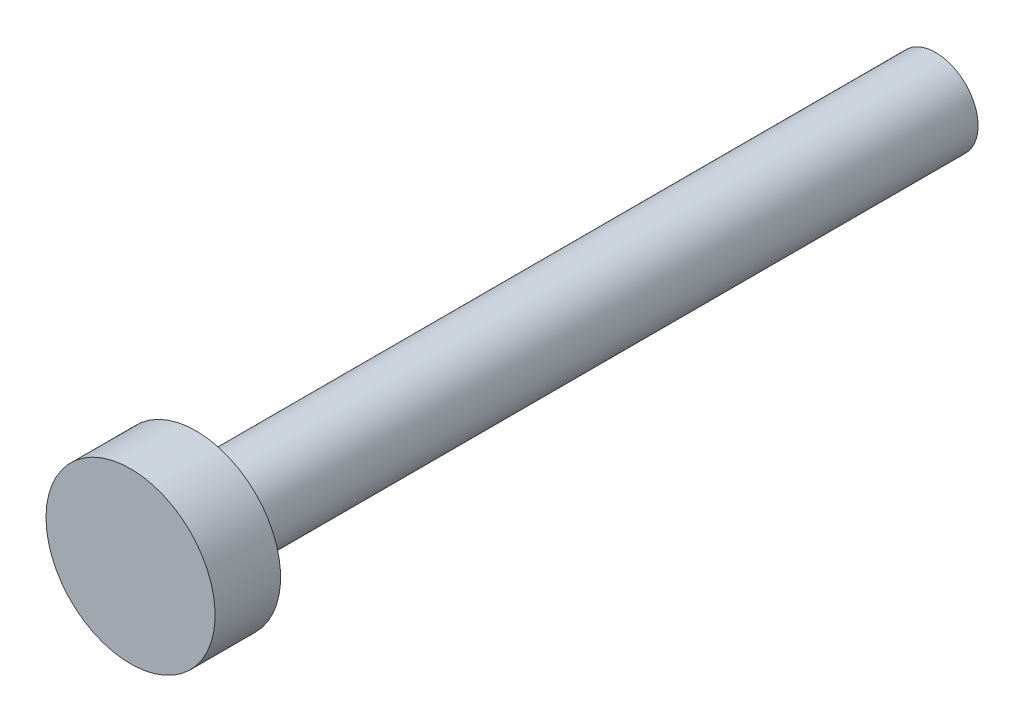
ISO-10303-21;
HEADER;
FILE_DESCRIPTION(('STEP AP214'),'2;1');
FILE_NAME('part.step','',(''),(''),'','','');
FILE_SCHEMA(('AUTOMOTIVE_DESIGN { 1 0 10303 214 1 1 1 1 }'));
ENDSEC;
DATA;
#1=APPLICATION_CONTEXT('core data for automotive mechanical design processes');
#2=APPLICATION_PROTOCOL_DEFINITION('international standard','automotive_design',2000,#1);
#3=PRODUCT_CONTEXT('',#1,'mechanical');
#4=PRODUCT('Part','Part','',(#3));
#5=PRODUCT_RELATED_PRODUCT_CATEGORY('part','',(#4));
#6=PRODUCT_DEFINITION_FORMATION('','',#4);
#7=PRODUCT_DEFINITION_CONTEXT('part definition',#1,'design');
#8=PRODUCT_DEFINITION('design','',#6,#7);
#9=PRODUCT_DEFINITION_SHAPE('','',#8);
#10=(LENGTH_UNIT() NAMED_UNIT(*) SI_UNIT(.MILLI.,.METRE.));
#11=(NAMED_UNIT(*) PLANE_ANGLE_UNIT() SI_UNIT($,.RADIAN.));
#12=(NAMED_UNIT(*) SI_UNIT($,.STERADIAN.) SOLID_ANGLE_UNIT());
#13=UNCERTAINTY_MEASURE_WITH_UNIT(LENGTH_MEASURE(1.E-05),#10,'distance_accuracy_value','');
#14=(GEOMETRIC_REPRESENTATION_CONTEXT(3) GLOBAL_UNCERTAINTY_ASSIGNED_CONTEXT((#13)) GLOBAL_UNIT_ASSIGNED_CONTEXT((#10,
#11,#12)) REPRESENTATION_CONTEXT('',''));
#15=CARTESIAN_POINT('',(0.,0.,0.));
#16=DIRECTION('',(0.,0.,1.));
#17=DIRECTION('',(1.,0.,0.));
#18=AXIS2_PLACEMENT_3D('',#15,#16,#17);
#19=CARTESIAN_POINT('',(0.,0.,3.1));
#20=DIRECTION('',(0.,0.,-1.));
#21=DIRECTION('',(-1.,0.,0.));
#22=AXIS2_PLACEMENT_3D('',#19,#20,#21);
#23=CYLINDRICAL_SURFACE('',#22,4.);
#24=CARTESIAN_POINT('',(0.,0.,3.1));
#25=DIRECTION('',(0.,0.,1.));
#26=DIRECTION('',(1.,0.,0.));
#27=AXIS2_PLACEMENT_3D('',#24,#25,#26);
#28=CIRCLE('',#27,4.);
#29=CARTESIAN_POINT('',(-4.,0.,3.1));
#30=VERTEX_POINT('',#29);
#31=EDGE_CURVE('E40',#30,#30,#28,.T.);
#32=CARTESIAN_POINT('',(0.,0.,0.));
#33=DIRECTION('',(0.,0.,1.));
#34=DIRECTION('',(1.,0.,0.));
#35=AXIS2_PLACEMENT_3D('',#32,#33,#34);
#36=CIRCLE('',#35,4.);
#37=CARTESIAN_POINT('',(-4.,0.,0.));
#38=VERTEX_POINT('',#37);
#39=EDGE_CURVE('E36',#38,#38,#36,.T.);
#40=CARTESIAN_POINT('',(-4.,0.,3.1));
#41=CARTESIAN_POINT('',(-4.,0.,3.06770833333333));
#42=CARTESIAN_POINT('',(-4.,0.,3.03541666666667));
#43=CARTESIAN_POINT('',(-4.,0.,2.97083333333333));
#44=CARTESIAN_POINT('',(-4.,0.,2.93854166666667));
#45=CARTESIAN_POINT('',(-4.,0.,2.87395833333333));
#46=CARTESIAN_POINT('',(-4.,0.,2.84166666666667));
#47=CARTESIAN_POINT('',(-4.,0.,2.77708333333333));
#48=CARTESIAN_POINT('',(-4.,0.,2.74479166666667));
#49=CARTESIAN_POINT('',(-4.,0.,2.68020833333333));
#50=CARTESIAN_POINT('',(-4.,0.,2.64791666666667));
#51=CARTESIAN_POINT('',(-4.,0.,2.58333333333333));
#52=CARTESIAN_POINT('',(-4.,0.,2.55104166666667));
#53=CARTESIAN_POINT('',(-4.,0.,2.48645833333333));
#54=CARTESIAN_POINT('',(-4.,0.,2.45416666666667));
#55=CARTESIAN_POINT('',(-4.,0.,2.38958333333333));
#56=CARTESIAN_POINT('',(-4.,0.,2.35729166666667));
#57=CARTESIAN_POINT('',(-4.,0.,2.29270833333333));
#58=CARTESIAN_POINT('',(-4.,0.,2.26041666666667));
#59=CARTESIAN_POINT('',(-4.,0.,2.19583333333333));
#60=CARTESIAN_POINT('',(-4.,0.,2.16354166666667));
#61=CARTESIAN_POINT('',(-4.,0.,2.09895833333333));
#62=CARTESIAN_POINT('',(-4.,0.,2.06666666666667));
#63=CARTESIAN_POINT('',(-4.,0.,2.00208333333333));
#64=CARTESIAN_POINT('',(-4.,0.,1.96979166666667));
#65=CARTESIAN_POINT('',(-4.,0.,1.90520833333333));
#66=CARTESIAN_POINT('',(-4.,0.,1.87291666666667));
#67=CARTESIAN_POINT('',(-4.,0.,1.80833333333333));
#68=CARTESIAN_POINT('',(-4.,0.,1.77604166666667));
#69=CARTESIAN_POINT('',(-4.,0.,1.71145833333333));
#70=CARTESIAN_POINT('',(-4.,0.,1.67916666666667));
#71=CARTESIAN_POINT('',(-4.,0.,1.61458333333333));
#72=CARTESIAN_POINT('',(-4.,0.,1.58229166666667));
#73=CARTESIAN_POINT('',(-4.,0.,1.51770833333333));
#74=CARTESIAN_POINT('',(-4.,0.,1.48541666666667));
#75=CARTESIAN_POINT('',(-4.,0.,1.42083333333333));
#76=CARTESIAN_POINT('',(-4.,0.,1.38854166666667));
#77=CARTESIAN_POINT('',(-4.,0.,1.32395833333333));
#78=CARTESIAN_POINT('',(-4.,0.,1.29166666666667));
#79=CARTESIAN_POINT('',(-4.,0.,1.22708333333333));
#80=CARTESIAN_POINT('',(-4.,0.,1.19479166666667));
#81=CARTESIAN_POINT('',(-4.,0.,1.13020833333333));
#82=CARTESIAN_POINT('',(-4.,0.,1.09791666666667));
#83=CARTESIAN_POINT('',(-4.,0.,1.03333333333333));
#84=CARTESIAN_POINT('',(-4.,0.,1.00104166666667));
#85=CARTESIAN_POINT('',(-4.,0.,0.936458333333333));
#86=CARTESIAN_POINT('',(-4.,0.,0.904166666666667));
#87=CARTESIAN_POINT('',(-4.,0.,0.839583333333333));
#88=CARTESIAN_POINT('',(-4.,0.,0.807291666666667));
#89=CARTESIAN_POINT('',(-4.,0.,0.742708333333333));
#90=CARTESIAN_POINT('',(-4.,0.,0.710416666666667));
#91=CARTESIAN_POINT('',(-4.,0.,0.645833333333333));
#92=CARTESIAN_POINT('',(-4.,0.,0.613541666666667));
#93=CARTESIAN_POINT('',(-4.,0.,0.548958333333333));
#94=CARTESIAN_POINT('',(-4.,0.,0.516666666666667));
#95=CARTESIAN_POINT('',(-4.,0.,0.452083333333333));
#96=CARTESIAN_POINT('',(-4.,0.,0.419791666666667));
#97=CARTESIAN_POINT('',(-4.,0.,0.355208333333333));
#98=CARTESIAN_POINT('',(-4.,0.,0.322916666666667));
#99=CARTESIAN_POINT('',(-4.,0.,0.258333333333333));
#100=CARTESIAN_POINT('',(-4.,0.,0.226041666666667));
#101=CARTESIAN_POINT('',(-4.,0.,0.161458333333333));
#102=CARTESIAN_POINT('',(-4.,0.,0.129166666666667));
#103=CARTESIAN_POINT('',(-4.,0.,0.0645833333333335));
#104=CARTESIAN_POINT('',(-4.,0.,0.0322916666666667));
#105=CARTESIAN_POINT('',(-4.,0.,0.));
#106=B_SPLINE_CURVE_WITH_KNOTS('',3,(#40,#41,#42,#43,#44,#45,#46,#47,#48,#49,#50,#51,#52,#53,
#54,#55,#56,#57,#58,#59,#60,#61,#62,#63,#64,#65,#66,#67,#68,#69,#70,#71,#72,#73,#74,#75,#76,#77,
#78,#79,#80,#81,#82,#83,#84,#85,#86,#87,#88,#89,#90,#91,#92,#93,#94,#95,#96,#97,#98,#99,#100,
#101,#102,#103,#104,#105),.UNSPECIFIED.,.F.,.F.,(4,2,2,2,2,2,2,2,2,2,2,2,2,2,2,2,2,2,2,2,2,2,2,
2,2,2,2,2,2,2,2,2,4),(0.,0.0968749999999997,0.19375,0.290625,0.3875,0.484375,0.58125,0.678125,
0.775,0.871874999999999,0.96875,1.065625,1.1625,1.259375,1.35625,1.453125,1.55,1.646875,1.74375,
1.840625,1.9375,2.034375,2.13125,2.228125,2.325,2.421875,2.51875,2.615625,2.7125,2.809375,
2.90625,3.003125,3.1),.UNSPECIFIED.);
#107=EDGE_CURVE('BSEAM33',#30,#38,#106,.T.);
#108=ORIENTED_EDGE('',*,*,#31,.F.);
#109=ORIENTED_EDGE('',*,*,#39,.T.);
#110=ORIENTED_EDGE('',*,*,#107,.T.);
#111=ORIENTED_EDGE('',*,*,#107,.F.);
#112=EDGE_LOOP('',(#108,#110,#109,#111));
#113=FACE_BOUND('',#112,.T.);
#114=ADVANCED_FACE('F33',(#113),#23,.T.);
#115=CARTESIAN_POINT('',(0.,0.,3.1));
#116=DIRECTION('',(0.,0.,1.));
#117=DIRECTION('',(1.,0.,0.));
#118=AXIS2_PLACEMENT_3D('',#115,#116,#117);
#119=PLANE('',#118);
#120=ORIENTED_EDGE('',*,*,#31,.T.);
#121=EDGE_LOOP('',(#120));
#122=FACE_BOUND('',#121,.T.);
#123=ADVANCED_FACE('F57',(#122),#119,.T.);
#124=CARTESIAN_POINT('',(0.,0.,0.));
#125=DIRECTION('',(0.,0.,1.));
#126=DIRECTION('',(1.,0.,0.));
#127=AXIS2_PLACEMENT_3D('',#124,#125,#126);
#128=PLANE('',#127);
#129=CARTESIAN_POINT('',(0.,0.,0.));
#130=DIRECTION('',(0.,0.,-1.));
#131=DIRECTION('',(-1.,0.,0.));
#132=AXIS2_PLACEMENT_3D('',#129,#130,#131);
#133=CIRCLE('',#132,2.);
#134=CARTESIAN_POINT('',(-2.,0.,0.));
#135=VERTEX_POINT('',#134);
#136=EDGE_CURVE('E10',#135,#135,#133,.T.);
#137=ORIENTED_EDGE('',*,*,#136,.F.);
#138=EDGE_LOOP('',(#137));
#139=FACE_BOUND('',#138,.T.);
#140=ORIENTED_EDGE('',*,*,#39,.F.);
#141=EDGE_LOOP('',(#140));
#142=FACE_BOUND('',#141,.T.);
#143=ADVANCED_FACE('F54',(#139,#142),#128,.F.);
#144=CARTESIAN_POINT('',(0.,0.,-35.));
#145=DIRECTION('',(0.,0.,1.));
#146=DIRECTION('',(1.,0.,0.));
#147=AXIS2_PLACEMENT_3D('',#144,#145,#146);
#148=CYLINDRICAL_SURFACE('',#147,2.);
#149=CARTESIAN_POINT('',(0.,0.,-35.));
#150=DIRECTION('',(0.,0.,-1.));
#151=DIRECTION('',(-1.,0.,0.));
#152=AXIS2_PLACEMENT_3D('',#149,#150,#151);
#153=CIRCLE('',#152,2.);
#154=CARTESIAN_POINT('',(-2.,0.,-35.));
#155=VERTEX_POINT('',#154);
#156=EDGE_CURVE('E46',#155,#155,#153,.T.);
#157=ORIENTED_EDGE('',*,*,#156,.F.);
#158=EDGE_LOOP('',(#157));
#159=FACE_BOUND('',#158,.T.);
#160=ORIENTED_EDGE('',*,*,#136,.T.);
#161=EDGE_LOOP('',(#160));
#162=FACE_BOUND('',#161,.T.);
#163=ADVANCED_FACE('F56',(#159,#162),#148,.T.);
#164=CARTESIAN_POINT('',(0.,0.,-35.));
#165=DIRECTION('',(0.,0.,-1.));
#166=DIRECTION('',(-1.,0.,0.));
#167=AXIS2_PLACEMENT_3D('',#164,#165,#166);
#168=PLANE('',#167);
#169=ORIENTED_EDGE('',*,*,#156,.T.);
#170=EDGE_LOOP('',(#169));
#171=FACE_BOUND('',#170,.T.);
#172=ADVANCED_FACE('F63',(#171),#168,.T.);
#173=CLOSED_SHELL('',(#114,#123,#143,#163,#172));
#174=MANIFOLD_SOLID_BREP('B2',#173);
#175=ADVANCED_BREP_SHAPE_REPRESENTATION('',(#18,#174),#14);
#176=SHAPE_DEFINITION_REPRESENTATION(#9,#175);
ENDSEC;
END-ISO-10303-21;
